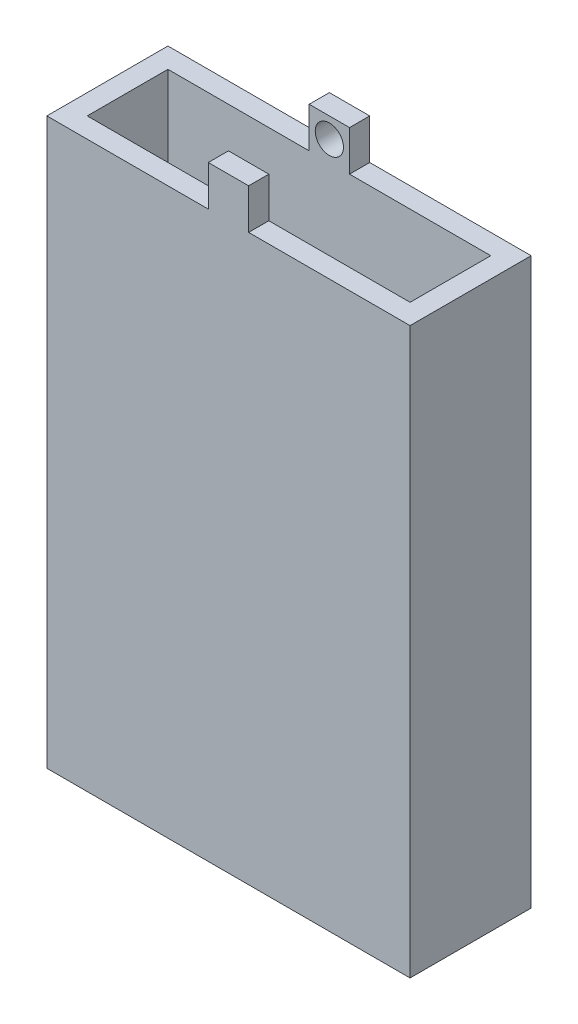
ISO-10303-21;
HEADER;
FILE_DESCRIPTION(('STEP AP214'),'2;1');
FILE_NAME('part.step','',(''),(''),'','','');
FILE_SCHEMA(('AUTOMOTIVE_DESIGN { 1 0 10303 214 1 1 1 1 }'));
ENDSEC;
DATA;
#1=APPLICATION_CONTEXT('core data for automotive mechanical design processes');
#2=APPLICATION_PROTOCOL_DEFINITION('international standard','automotive_design',2000,#1);
#3=PRODUCT_CONTEXT('',#1,'mechanical');
#4=PRODUCT('Part','Part','',(#3));
#5=PRODUCT_RELATED_PRODUCT_CATEGORY('part','',(#4));
#6=PRODUCT_DEFINITION_FORMATION('','',#4);
#7=PRODUCT_DEFINITION_CONTEXT('part definition',#1,'design');
#8=PRODUCT_DEFINITION('design','',#6,#7);
#9=PRODUCT_DEFINITION_SHAPE('','',#8);
#10=(LENGTH_UNIT() NAMED_UNIT(*) SI_UNIT(.MILLI.,.METRE.));
#11=(NAMED_UNIT(*) PLANE_ANGLE_UNIT() SI_UNIT($,.RADIAN.));
#12=(NAMED_UNIT(*) SI_UNIT($,.STERADIAN.) SOLID_ANGLE_UNIT());
#13=UNCERTAINTY_MEASURE_WITH_UNIT(LENGTH_MEASURE(1.E-05),#10,'distance_accuracy_value','');
#14=(GEOMETRIC_REPRESENTATION_CONTEXT(3) GLOBAL_UNCERTAINTY_ASSIGNED_CONTEXT((#13)) GLOBAL_UNIT_ASSIGNED_CONTEXT((#10,
#11,#12)) REPRESENTATION_CONTEXT('',''));
#15=CARTESIAN_POINT('',(0.,0.,0.));
#16=DIRECTION('',(0.,0.,1.));
#17=DIRECTION('',(1.,0.,0.));
#18=AXIS2_PLACEMENT_3D('',#15,#16,#17);
#19=CARTESIAN_POINT('',(-7.78802364302131,150.,-3.84234495329359));
#20=DIRECTION('',(1.,0.,0.));
#21=DIRECTION('',(0.,0.,-1.));
#22=AXIS2_PLACEMENT_3D('',#19,#20,#21);
#23=PLANE('',#22);
#24=DIRECTION('',(0.,0.,1.));
#25=VECTOR('',#24,1.);
#26=CARTESIAN_POINT('',(-7.78802364302131,150.,-3.84234495329359));
#27=LINE('',#26,#25);
#28=CARTESIAN_POINT('',(-7.78802364302132,150.,21.1576550467064));
#29=VERTEX_POINT('',#28);
#30=CARTESIAN_POINT('',(-7.78802364302131,150.,26.1576550467064));
#31=VERTEX_POINT('',#30);
#32=EDGE_CURVE('E165',#29,#31,#27,.T.);
#33=ORIENTED_EDGE('',*,*,#32,.F.);
#34=DIRECTION('',(0.,-1.,0.));
#35=VECTOR('',#34,1.);
#36=CARTESIAN_POINT('',(-7.78802364302132,150.,21.1576550467064));
#37=LINE('',#36,#35);
#38=CARTESIAN_POINT('',(-7.78802364302132,140.,21.1576550467064));
#39=VERTEX_POINT('',#38);
#40=EDGE_CURVE('E162',#29,#39,#37,.T.);
#41=ORIENTED_EDGE('',*,*,#40,.T.);
#42=DIRECTION('',(0.,0.,1.));
#43=VECTOR('',#42,1.);
#44=CARTESIAN_POINT('',(-7.78802364302131,140.,-3.84234495329359));
#45=LINE('',#44,#43);
#46=CARTESIAN_POINT('',(-7.78802364302129,140.,26.1576550467064));
#47=VERTEX_POINT('',#46);
#48=EDGE_CURVE('E11',#39,#47,#45,.T.);
#49=ORIENTED_EDGE('',*,*,#48,.T.);
#50=DIRECTION('',(0.,-1.,0.));
#51=VECTOR('',#50,1.);
#52=CARTESIAN_POINT('',(-7.78802364302131,150.,26.1576550467064));
#53=LINE('',#52,#51);
#54=EDGE_CURVE('E426',#31,#47,#53,.T.);
#55=ORIENTED_EDGE('',*,*,#54,.F.);
#56=EDGE_LOOP('',(#33,#41,#49,#55));
#57=FACE_BOUND('',#56,.T.);
#58=ADVANCED_FACE('F45',(#57),#23,.F.);
#59=CARTESIAN_POINT('',(2.21197635697867,150.,-3.84234495329359));
#60=DIRECTION('',(-1.,0.,0.));
#61=DIRECTION('',(0.,0.,1.));
#62=AXIS2_PLACEMENT_3D('',#59,#60,#61);
#63=PLANE('',#62);
#64=DIRECTION('',(0.,0.,-1.));
#65=VECTOR('',#64,1.);
#66=CARTESIAN_POINT('',(2.21197635697867,140.,-3.84234495329359));
#67=LINE('',#66,#65);
#68=CARTESIAN_POINT('',(2.21197635697869,140.,26.1576550467064));
#69=VERTEX_POINT('',#68);
#70=CARTESIAN_POINT('',(2.21197635697867,140.,21.1576550467064));
#71=VERTEX_POINT('',#70);
#72=EDGE_CURVE('E64',#69,#71,#67,.T.);
#73=ORIENTED_EDGE('',*,*,#72,.T.);
#74=DIRECTION('',(0.,-1.,0.));
#75=VECTOR('',#74,1.);
#76=CARTESIAN_POINT('',(2.21197635697867,150.,21.1576550467064));
#77=LINE('',#76,#75);
#78=CARTESIAN_POINT('',(2.21197635697867,150.,21.1576550467064));
#79=VERTEX_POINT('',#78);
#80=EDGE_CURVE('E300',#79,#71,#77,.T.);
#81=ORIENTED_EDGE('',*,*,#80,.F.);
#82=DIRECTION('',(0.,0.,-1.));
#83=VECTOR('',#82,1.);
#84=CARTESIAN_POINT('',(2.21197635697867,150.,-3.84234495329359));
#85=LINE('',#84,#83);
#86=CARTESIAN_POINT('',(2.21197635697867,150.,26.1576550467064));
#87=VERTEX_POINT('',#86);
#88=EDGE_CURVE('E285',#87,#79,#85,.T.);
#89=ORIENTED_EDGE('',*,*,#88,.F.);
#90=DIRECTION('',(0.,-1.,0.));
#91=VECTOR('',#90,1.);
#92=CARTESIAN_POINT('',(2.21197635697867,150.,26.1576550467064));
#93=LINE('',#92,#91);
#94=EDGE_CURVE('E428',#87,#69,#93,.T.);
#95=ORIENTED_EDGE('',*,*,#94,.T.);
#96=EDGE_LOOP('',(#73,#81,#89,#95));
#97=FACE_BOUND('',#96,.T.);
#98=ADVANCED_FACE('F338',(#97),#63,.F.);
#99=CARTESIAN_POINT('',(0.,150.,0.));
#100=DIRECTION('',(0.,1.,0.));
#101=DIRECTION('',(0.,0.,1.));
#102=AXIS2_PLACEMENT_3D('',#99,#100,#101);
#103=PLANE('',#102);
#104=DIRECTION('',(1.,0.,0.));
#105=VECTOR('',#104,1.);
#106=CARTESIAN_POINT('',(-7.78802364302132,150.,21.1576550467064));
#107=LINE('',#106,#105);
#108=EDGE_CURVE('E273',#29,#79,#107,.T.);
#109=ORIENTED_EDGE('',*,*,#108,.F.);
#110=ORIENTED_EDGE('',*,*,#32,.T.);
#111=DIRECTION('',(1.,0.,0.));
#112=VECTOR('',#111,1.);
#113=CARTESIAN_POINT('',(-7.78802364302131,150.,26.1576550467064));
#114=LINE('',#113,#112);
#115=EDGE_CURVE('E290',#31,#87,#114,.T.);
#116=ORIENTED_EDGE('',*,*,#115,.T.);
#117=ORIENTED_EDGE('',*,*,#88,.T.);
#118=EDGE_LOOP('',(#109,#110,#116,#117));
#119=FACE_BOUND('',#118,.T.);
#120=ADVANCED_FACE('F345',(#119),#103,.T.);
#121=CARTESIAN_POINT('',(0.,140.,0.));
#122=DIRECTION('',(0.,1.,0.));
#123=DIRECTION('',(0.,0.,1.));
#124=AXIS2_PLACEMENT_3D('',#121,#122,#123);
#125=PLANE('',#124);
#126=CARTESIAN_POINT('',(-7.78802364302129,140.,-3.84234495329359));
#127=VERTEX_POINT('',#126);
#128=CARTESIAN_POINT('',(-7.78802364302131,140.,1.15765504670641));
#129=VERTEX_POINT('',#128);
#130=EDGE_CURVE('E57',#127,#129,#45,.T.);
#131=ORIENTED_EDGE('',*,*,#130,.F.);
#132=DIRECTION('',(-1.,0.,0.));
#133=VECTOR('',#132,1.);
#134=CARTESIAN_POINT('',(42.2119763569787,140.,-3.84234495329359));
#135=LINE('',#134,#133);
#136=CARTESIAN_POINT('',(-47.7880236430213,140.,-3.84234495329358));
#137=VERTEX_POINT('',#136);
#138=EDGE_CURVE('E218',#127,#137,#135,.T.);
#139=ORIENTED_EDGE('',*,*,#138,.T.);
#140=DIRECTION('',(0.,0.,1.));
#141=VECTOR('',#140,1.);
#142=CARTESIAN_POINT('',(-47.7880236430213,140.,26.1576550467064));
#143=LINE('',#142,#141);
#144=CARTESIAN_POINT('',(-47.7880236430213,140.,26.1576550467064));
#145=VERTEX_POINT('',#144);
#146=EDGE_CURVE('E223',#137,#145,#143,.T.);
#147=ORIENTED_EDGE('',*,*,#146,.T.);
#148=DIRECTION('',(1.,0.,0.));
#149=VECTOR('',#148,1.);
#150=CARTESIAN_POINT('',(42.2119763569787,140.,26.1576550467064));
#151=LINE('',#150,#149);
#152=EDGE_CURVE('E72',#145,#47,#151,.T.);
#153=ORIENTED_EDGE('',*,*,#152,.T.);
#154=ORIENTED_EDGE('',*,*,#48,.F.);
#155=DIRECTION('',(1.,0.,0.));
#156=VECTOR('',#155,1.);
#157=CARTESIAN_POINT('',(-42.7880236430213,140.,21.1576550467064));
#158=LINE('',#157,#156);
#159=CARTESIAN_POINT('',(-42.7880236430213,140.,21.1576550467064));
#160=VERTEX_POINT('',#159);
#161=EDGE_CURVE('E176',#160,#39,#158,.T.);
#162=ORIENTED_EDGE('',*,*,#161,.F.);
#163=DIRECTION('',(0.,0.,1.));
#164=VECTOR('',#163,1.);
#165=CARTESIAN_POINT('',(-42.7880236430213,140.,1.15765504670641));
#166=LINE('',#165,#164);
#167=CARTESIAN_POINT('',(-42.7880236430213,140.,1.15765504670641));
#168=VERTEX_POINT('',#167);
#169=EDGE_CURVE('E190',#168,#160,#166,.T.);
#170=ORIENTED_EDGE('',*,*,#169,.F.);
#171=DIRECTION('',(-1.,0.,0.));
#172=VECTOR('',#171,1.);
#173=CARTESIAN_POINT('',(-42.7880236430213,140.,1.15765504670641));
#174=LINE('',#173,#172);
#175=EDGE_CURVE('E188',#129,#168,#174,.T.);
#176=ORIENTED_EDGE('',*,*,#175,.F.);
#177=EDGE_LOOP('',(#131,#139,#147,#153,#154,#162,#170,#176));
#178=FACE_BOUND('',#177,.T.);
#179=ADVANCED_FACE('F174',(#178),#125,.T.);
#180=CARTESIAN_POINT('',(42.2119763569787,140.,26.1576550467064));
#181=DIRECTION('',(-1.,0.,0.));
#182=DIRECTION('',(0.,0.,1.));
#183=AXIS2_PLACEMENT_3D('',#180,#181,#182);
#184=PLANE('',#183);
#185=DIRECTION('',(0.,0.,-1.));
#186=VECTOR('',#185,1.);
#187=CARTESIAN_POINT('',(42.2119763569787,0.,26.1576550467064));
#188=LINE('',#187,#186);
#189=CARTESIAN_POINT('',(42.2119763569787,0.,26.1576550467064));
#190=VERTEX_POINT('',#189);
#191=CARTESIAN_POINT('',(42.2119763569787,0.,-3.84234495329359));
#192=VERTEX_POINT('',#191);
#193=EDGE_CURVE('E203',#190,#192,#188,.T.);
#194=ORIENTED_EDGE('',*,*,#193,.T.);
#195=DIRECTION('',(0.,-1.,0.));
#196=VECTOR('',#195,1.);
#197=CARTESIAN_POINT('',(42.2119763569787,140.,-3.84234495329359));
#198=LINE('',#197,#196);
#199=CARTESIAN_POINT('',(42.2119763569787,140.,-3.84234495329359));
#200=VERTEX_POINT('',#199);
#201=EDGE_CURVE('E251',#200,#192,#198,.T.);
#202=ORIENTED_EDGE('',*,*,#201,.F.);
#203=DIRECTION('',(0.,0.,-1.));
#204=VECTOR('',#203,1.);
#205=CARTESIAN_POINT('',(42.2119763569787,140.,26.1576550467064));
#206=LINE('',#205,#204);
#207=CARTESIAN_POINT('',(42.2119763569787,140.,26.1576550467064));
#208=VERTEX_POINT('',#207);
#209=EDGE_CURVE('E214',#208,#200,#206,.T.);
#210=ORIENTED_EDGE('',*,*,#209,.F.);
#211=DIRECTION('',(0.,-1.,0.));
#212=VECTOR('',#211,1.);
#213=CARTESIAN_POINT('',(42.2119763569787,140.,26.1576550467064));
#214=LINE('',#213,#212);
#215=EDGE_CURVE('E229',#208,#190,#214,.T.);
#216=ORIENTED_EDGE('',*,*,#215,.T.);
#217=EDGE_LOOP('',(#194,#202,#210,#216));
#218=FACE_BOUND('',#217,.T.);
#219=ADVANCED_FACE('F47',(#218),#184,.F.);
#220=CARTESIAN_POINT('',(42.2119763569787,140.,-3.84234495329359));
#221=DIRECTION('',(0.,0.,1.));
#222=DIRECTION('',(1.,0.,0.));
#223=AXIS2_PLACEMENT_3D('',#220,#221,#222);
#224=PLANE('',#223);
#225=CARTESIAN_POINT('',(-2.78802364302131,145.,-3.84234495329359));
#226=DIRECTION('',(0.,0.,-1.));
#227=DIRECTION('',(-1.,0.,0.));
#228=AXIS2_PLACEMENT_3D('',#225,#226,#227);
#229=CIRCLE('',#228,3.5);
#230=CARTESIAN_POINT('',(-6.28802364302132,145.,-3.84234495329359));
#231=VERTEX_POINT('',#230);
#232=EDGE_CURVE('E309',#231,#231,#229,.T.);
#233=ORIENTED_EDGE('',*,*,#232,.F.);
#234=EDGE_LOOP('',(#233));
#235=FACE_BOUND('',#234,.T.);
#236=DIRECTION('',(-1.,0.,0.));
#237=VECTOR('',#236,1.);
#238=CARTESIAN_POINT('',(42.2119763569787,0.,-3.84234495329359));
#239=LINE('',#238,#237);
#240=CARTESIAN_POINT('',(-47.7880236430213,0.,-3.84234495329358));
#241=VERTEX_POINT('',#240);
#242=EDGE_CURVE('E233',#192,#241,#239,.T.);
#243=ORIENTED_EDGE('',*,*,#242,.T.);
#244=DIRECTION('',(0.,-1.,0.));
#245=VECTOR('',#244,1.);
#246=CARTESIAN_POINT('',(-47.7880236430213,140.,-3.84234495329358));
#247=LINE('',#246,#245);
#248=EDGE_CURVE('E248',#137,#241,#247,.T.);
#249=ORIENTED_EDGE('',*,*,#248,.F.);
#250=ORIENTED_EDGE('',*,*,#138,.F.);
#251=DIRECTION('',(0.,-1.,0.));
#252=VECTOR('',#251,1.);
#253=CARTESIAN_POINT('',(-7.78802364302131,150.,-3.84234495329359));
#254=LINE('',#253,#252);
#255=CARTESIAN_POINT('',(-7.78802364302131,150.,-3.84234495329359));
#256=VERTEX_POINT('',#255);
#257=EDGE_CURVE('E284',#256,#127,#254,.T.);
#258=ORIENTED_EDGE('',*,*,#257,.F.);
#259=DIRECTION('',(-1.,0.,0.));
#260=VECTOR('',#259,1.);
#261=CARTESIAN_POINT('',(-7.78802364302131,150.,-3.84234495329359));
#262=LINE('',#261,#260);
#263=CARTESIAN_POINT('',(2.21197635697867,150.,-3.84234495329359));
#264=VERTEX_POINT('',#263);
#265=EDGE_CURVE('E281',#264,#256,#262,.T.);
#266=ORIENTED_EDGE('',*,*,#265,.F.);
#267=DIRECTION('',(0.,-1.,0.));
#268=VECTOR('',#267,1.);
#269=CARTESIAN_POINT('',(2.21197635697867,150.,-3.84234495329359));
#270=LINE('',#269,#268);
#271=CARTESIAN_POINT('',(2.21197635697867,140.,-3.84234495329359));
#272=VERTEX_POINT('',#271);
#273=EDGE_CURVE('E432',#264,#272,#270,.T.);
#274=ORIENTED_EDGE('',*,*,#273,.T.);
#275=EDGE_CURVE('E220',#200,#272,#135,.T.);
#276=ORIENTED_EDGE('',*,*,#275,.F.);
#277=ORIENTED_EDGE('',*,*,#201,.T.);
#278=EDGE_LOOP('',(#243,#249,#250,#258,#266,#274,#276,#277));
#279=FACE_BOUND('',#278,.T.);
#280=ADVANCED_FACE('F386',(#235,#279),#224,.F.);
#281=CARTESIAN_POINT('',(-47.7880236430213,140.,26.1576550467064));
#282=DIRECTION('',(1.,0.,0.));
#283=DIRECTION('',(0.,0.,-1.));
#284=AXIS2_PLACEMENT_3D('',#281,#282,#283);
#285=PLANE('',#284);
#286=DIRECTION('',(0.,0.,1.));
#287=VECTOR('',#286,1.);
#288=CARTESIAN_POINT('',(-47.7880236430213,0.,26.1576550467064));
#289=LINE('',#288,#287);
#290=CARTESIAN_POINT('',(-47.7880236430213,0.,26.1576550467064));
#291=VERTEX_POINT('',#290);
#292=EDGE_CURVE('E236',#241,#291,#289,.T.);
#293=ORIENTED_EDGE('',*,*,#292,.T.);
#294=DIRECTION('',(0.,-1.,0.));
#295=VECTOR('',#294,1.);
#296=CARTESIAN_POINT('',(-47.7880236430213,140.,26.1576550467064));
#297=LINE('',#296,#295);
#298=EDGE_CURVE('E244',#145,#291,#297,.T.);
#299=ORIENTED_EDGE('',*,*,#298,.F.);
#300=ORIENTED_EDGE('',*,*,#146,.F.);
#301=ORIENTED_EDGE('',*,*,#248,.T.);
#302=EDGE_LOOP('',(#293,#299,#300,#301));
#303=FACE_BOUND('',#302,.T.);
#304=ADVANCED_FACE('F383',(#303),#285,.F.);
#305=CARTESIAN_POINT('',(42.2119763569787,140.,26.1576550467064));
#306=DIRECTION('',(0.,0.,-1.));
#307=DIRECTION('',(-1.,0.,0.));
#308=AXIS2_PLACEMENT_3D('',#305,#306,#307);
#309=PLANE('',#308);
#310=DIRECTION('',(1.,0.,0.));
#311=VECTOR('',#310,1.);
#312=CARTESIAN_POINT('',(42.2119763569787,0.,26.1576550467064));
#313=LINE('',#312,#311);
#314=EDGE_CURVE('E219',#291,#190,#313,.T.);
#315=ORIENTED_EDGE('',*,*,#314,.T.);
#316=ORIENTED_EDGE('',*,*,#215,.F.);
#317=EDGE_CURVE('E226',#69,#208,#151,.T.);
#318=ORIENTED_EDGE('',*,*,#317,.F.);
#319=ORIENTED_EDGE('',*,*,#94,.F.);
#320=ORIENTED_EDGE('',*,*,#115,.F.);
#321=ORIENTED_EDGE('',*,*,#54,.T.);
#322=ORIENTED_EDGE('',*,*,#152,.F.);
#323=ORIENTED_EDGE('',*,*,#298,.T.);
#324=EDGE_LOOP('',(#315,#316,#318,#319,#320,#321,#322,#323));
#325=FACE_BOUND('',#324,.T.);
#326=ADVANCED_FACE('F378',(#325),#309,.F.);
#327=ORIENTED_EDGE('',*,*,#72,.F.);
#328=ORIENTED_EDGE('',*,*,#317,.T.);
#329=ORIENTED_EDGE('',*,*,#209,.T.);
#330=ORIENTED_EDGE('',*,*,#275,.T.);
#331=CARTESIAN_POINT('',(2.21197635697867,140.,1.15765504670641));
#332=VERTEX_POINT('',#331);
#333=EDGE_CURVE('E55',#332,#272,#67,.T.);
#334=ORIENTED_EDGE('',*,*,#333,.F.);
#335=CARTESIAN_POINT('',(37.2119763569787,140.,1.15765504670641));
#336=VERTEX_POINT('',#335);
#337=EDGE_CURVE('E194',#336,#332,#174,.T.);
#338=ORIENTED_EDGE('',*,*,#337,.F.);
#339=DIRECTION('',(0.,0.,-1.));
#340=VECTOR('',#339,1.);
#341=CARTESIAN_POINT('',(37.2119763569787,140.,1.15765504670641));
#342=LINE('',#341,#340);
#343=CARTESIAN_POINT('',(37.2119763569787,140.,21.1576550467064));
#344=VERTEX_POINT('',#343);
#345=EDGE_CURVE('E182',#344,#336,#342,.T.);
#346=ORIENTED_EDGE('',*,*,#345,.F.);
#347=EDGE_CURVE('E183',#71,#344,#158,.T.);
#348=ORIENTED_EDGE('',*,*,#347,.F.);
#349=EDGE_LOOP('',(#327,#328,#329,#330,#334,#338,#346,#348));
#350=FACE_BOUND('',#349,.T.);
#351=ADVANCED_FACE('F376',(#350),#125,.T.);
#352=CARTESIAN_POINT('',(0.,0.,0.));
#353=DIRECTION('',(0.,1.,0.));
#354=DIRECTION('',(0.,0.,1.));
#355=AXIS2_PLACEMENT_3D('',#352,#353,#354);
#356=PLANE('',#355);
#357=ORIENTED_EDGE('',*,*,#193,.F.);
#358=ORIENTED_EDGE('',*,*,#314,.F.);
#359=ORIENTED_EDGE('',*,*,#292,.F.);
#360=ORIENTED_EDGE('',*,*,#242,.F.);
#361=EDGE_LOOP('',(#357,#358,#359,#360));
#362=FACE_BOUND('',#361,.T.);
#363=ADVANCED_FACE('F374',(#362),#356,.F.);
#364=CARTESIAN_POINT('',(-42.7880236430213,5.,1.15765504670641));
#365=DIRECTION('',(-1.,0.,0.));
#366=DIRECTION('',(0.,0.,1.));
#367=AXIS2_PLACEMENT_3D('',#364,#365,#366);
#368=PLANE('',#367);
#369=ORIENTED_EDGE('',*,*,#169,.T.);
#370=DIRECTION('',(0.,1.,0.));
#371=VECTOR('',#370,1.);
#372=CARTESIAN_POINT('',(-42.7880236430213,5.,21.1576550467064));
#373=LINE('',#372,#371);
#374=CARTESIAN_POINT('',(-42.7880236430213,5.,21.1576550467064));
#375=VERTEX_POINT('',#374);
#376=EDGE_CURVE('E180',#375,#160,#373,.T.);
#377=ORIENTED_EDGE('',*,*,#376,.F.);
#378=DIRECTION('',(0.,0.,1.));
#379=VECTOR('',#378,1.);
#380=CARTESIAN_POINT('',(-42.7880236430213,5.,1.15765504670641));
#381=LINE('',#380,#379);
#382=CARTESIAN_POINT('',(-42.7880236430213,5.,1.15765504670641));
#383=VERTEX_POINT('',#382);
#384=EDGE_CURVE('E198',#383,#375,#381,.T.);
#385=ORIENTED_EDGE('',*,*,#384,.F.);
#386=DIRECTION('',(0.,1.,0.));
#387=VECTOR('',#386,1.);
#388=CARTESIAN_POINT('',(-42.7880236430213,5.,1.15765504670641));
#389=LINE('',#388,#387);
#390=EDGE_CURVE('E199',#383,#168,#389,.T.);
#391=ORIENTED_EDGE('',*,*,#390,.T.);
#392=EDGE_LOOP('',(#369,#377,#385,#391));
#393=FACE_BOUND('',#392,.T.);
#394=ADVANCED_FACE('F368',(#393),#368,.F.);
#395=CARTESIAN_POINT('',(-42.7880236430213,5.,1.15765504670641));
#396=DIRECTION('',(0.,0.,-1.));
#397=DIRECTION('',(-1.,0.,0.));
#398=AXIS2_PLACEMENT_3D('',#395,#396,#397);
#399=PLANE('',#398);
#400=CARTESIAN_POINT('',(-2.78802364302131,145.,1.15765504670641));
#401=DIRECTION('',(0.,0.,-1.));
#402=DIRECTION('',(-1.,0.,0.));
#403=AXIS2_PLACEMENT_3D('',#400,#401,#402);
#404=CIRCLE('',#403,3.5);
#405=CARTESIAN_POINT('',(-6.28802364302132,145.,1.15765504670641));
#406=VERTEX_POINT('',#405);
#407=EDGE_CURVE('E303',#406,#406,#404,.T.);
#408=ORIENTED_EDGE('',*,*,#407,.T.);
#409=EDGE_LOOP('',(#408));
#410=FACE_BOUND('',#409,.T.);
#411=ORIENTED_EDGE('',*,*,#337,.T.);
#412=DIRECTION('',(0.,1.,0.));
#413=VECTOR('',#412,1.);
#414=CARTESIAN_POINT('',(2.21197635697867,150.,1.15765504670641));
#415=LINE('',#414,#413);
#416=CARTESIAN_POINT('',(2.21197635697867,150.,1.15765504670641));
#417=VERTEX_POINT('',#416);
#418=EDGE_CURVE('E171',#332,#417,#415,.T.);
#419=ORIENTED_EDGE('',*,*,#418,.T.);
#420=DIRECTION('',(1.,0.,0.));
#421=VECTOR('',#420,1.);
#422=CARTESIAN_POINT('',(-7.78802364302132,150.,1.15765504670641));
#423=LINE('',#422,#421);
#424=CARTESIAN_POINT('',(-7.78802364302132,150.,1.15765504670641));
#425=VERTEX_POINT('',#424);
#426=EDGE_CURVE('E278',#425,#417,#423,.T.);
#427=ORIENTED_EDGE('',*,*,#426,.F.);
#428=DIRECTION('',(0.,1.,0.));
#429=VECTOR('',#428,1.);
#430=CARTESIAN_POINT('',(-7.78802364302132,150.,1.15765504670641));
#431=LINE('',#430,#429);
#432=EDGE_CURVE('E170',#129,#425,#431,.T.);
#433=ORIENTED_EDGE('',*,*,#432,.F.);
#434=ORIENTED_EDGE('',*,*,#175,.T.);
#435=ORIENTED_EDGE('',*,*,#390,.F.);
#436=DIRECTION('',(-1.,0.,0.));
#437=VECTOR('',#436,1.);
#438=CARTESIAN_POINT('',(-42.7880236430213,5.,1.15765504670641));
#439=LINE('',#438,#437);
#440=CARTESIAN_POINT('',(37.2119763569787,5.,1.15765504670641));
#441=VERTEX_POINT('',#440);
#442=EDGE_CURVE('E213',#441,#383,#439,.T.);
#443=ORIENTED_EDGE('',*,*,#442,.F.);
#444=DIRECTION('',(0.,1.,0.));
#445=VECTOR('',#444,1.);
#446=CARTESIAN_POINT('',(37.2119763569787,5.,1.15765504670641));
#447=LINE('',#446,#445);
#448=EDGE_CURVE('E204',#441,#336,#447,.T.);
#449=ORIENTED_EDGE('',*,*,#448,.T.);
#450=EDGE_LOOP('',(#411,#419,#427,#433,#434,#435,#443,#449));
#451=FACE_BOUND('',#450,.T.);
#452=ADVANCED_FACE('F365',(#410,#451),#399,.F.);
#453=CARTESIAN_POINT('',(37.2119763569787,5.,1.15765504670641));
#454=DIRECTION('',(1.,0.,0.));
#455=DIRECTION('',(0.,0.,-1.));
#456=AXIS2_PLACEMENT_3D('',#453,#454,#455);
#457=PLANE('',#456);
#458=ORIENTED_EDGE('',*,*,#345,.T.);
#459=ORIENTED_EDGE('',*,*,#448,.F.);
#460=DIRECTION('',(0.,0.,-1.));
#461=VECTOR('',#460,1.);
#462=CARTESIAN_POINT('',(37.2119763569787,5.,1.15765504670641));
#463=LINE('',#462,#461);
#464=CARTESIAN_POINT('',(37.2119763569787,5.,21.1576550467064));
#465=VERTEX_POINT('',#464);
#466=EDGE_CURVE('E411',#465,#441,#463,.T.);
#467=ORIENTED_EDGE('',*,*,#466,.F.);
#468=DIRECTION('',(0.,1.,0.));
#469=VECTOR('',#468,1.);
#470=CARTESIAN_POINT('',(37.2119763569787,5.,21.1576550467064));
#471=LINE('',#470,#469);
#472=EDGE_CURVE('E207',#465,#344,#471,.T.);
#473=ORIENTED_EDGE('',*,*,#472,.T.);
#474=EDGE_LOOP('',(#458,#459,#467,#473));
#475=FACE_BOUND('',#474,.T.);
#476=ADVANCED_FACE('F361',(#475),#457,.F.);
#477=CARTESIAN_POINT('',(-42.7880236430213,5.,21.1576550467064));
#478=DIRECTION('',(0.,0.,1.));
#479=DIRECTION('',(1.,0.,0.));
#480=AXIS2_PLACEMENT_3D('',#477,#478,#479);
#481=PLANE('',#480);
#482=CARTESIAN_POINT('',(-2.78802364302131,145.,21.1576550467064));
#483=DIRECTION('',(0.,0.,1.));
#484=DIRECTION('',(1.,0.,0.));
#485=AXIS2_PLACEMENT_3D('',#482,#483,#484);
#486=CIRCLE('',#485,3.5);
#487=CARTESIAN_POINT('',(0.711976356978691,145.,21.1576550467064));
#488=VERTEX_POINT('',#487);
#489=EDGE_CURVE('E49',#488,#488,#486,.T.);
#490=ORIENTED_EDGE('',*,*,#489,.T.);
#491=EDGE_LOOP('',(#490));
#492=FACE_BOUND('',#491,.T.);
#493=ORIENTED_EDGE('',*,*,#161,.T.);
#494=ORIENTED_EDGE('',*,*,#40,.F.);
#495=ORIENTED_EDGE('',*,*,#108,.T.);
#496=ORIENTED_EDGE('',*,*,#80,.T.);
#497=ORIENTED_EDGE('',*,*,#347,.T.);
#498=ORIENTED_EDGE('',*,*,#472,.F.);
#499=DIRECTION('',(1.,0.,0.));
#500=VECTOR('',#499,1.);
#501=CARTESIAN_POINT('',(-42.7880236430213,5.,21.1576550467064));
#502=LINE('',#501,#500);
#503=EDGE_CURVE('E414',#375,#465,#502,.T.);
#504=ORIENTED_EDGE('',*,*,#503,.F.);
#505=ORIENTED_EDGE('',*,*,#376,.T.);
#506=EDGE_LOOP('',(#493,#494,#495,#496,#497,#498,#504,#505));
#507=FACE_BOUND('',#506,.T.);
#508=ADVANCED_FACE('F178',(#492,#507),#481,.F.);
#509=CARTESIAN_POINT('',(0.,5.,0.));
#510=DIRECTION('',(0.,1.,0.));
#511=DIRECTION('',(0.,0.,1.));
#512=AXIS2_PLACEMENT_3D('',#509,#510,#511);
#513=PLANE('',#512);
#514=ORIENTED_EDGE('',*,*,#384,.T.);
#515=ORIENTED_EDGE('',*,*,#503,.T.);
#516=ORIENTED_EDGE('',*,*,#466,.T.);
#517=ORIENTED_EDGE('',*,*,#442,.T.);
#518=EDGE_LOOP('',(#514,#515,#516,#517));
#519=FACE_BOUND('',#518,.T.);
#520=ADVANCED_FACE('F350',(#519),#513,.T.);
#521=ORIENTED_EDGE('',*,*,#130,.T.);
#522=ORIENTED_EDGE('',*,*,#432,.T.);
#523=EDGE_CURVE('E270',#256,#425,#27,.T.);
#524=ORIENTED_EDGE('',*,*,#523,.F.);
#525=ORIENTED_EDGE('',*,*,#257,.T.);
#526=EDGE_LOOP('',(#521,#522,#524,#525));
#527=FACE_BOUND('',#526,.T.);
#528=ADVANCED_FACE('F340',(#527),#23,.F.);
#529=EDGE_CURVE('E289',#417,#264,#85,.T.);
#530=ORIENTED_EDGE('',*,*,#529,.F.);
#531=ORIENTED_EDGE('',*,*,#418,.F.);
#532=ORIENTED_EDGE('',*,*,#333,.T.);
#533=ORIENTED_EDGE('',*,*,#273,.F.);
#534=EDGE_LOOP('',(#530,#531,#532,#533));
#535=FACE_BOUND('',#534,.T.);
#536=ADVANCED_FACE('F347',(#535),#63,.F.);
#537=ORIENTED_EDGE('',*,*,#426,.T.);
#538=ORIENTED_EDGE('',*,*,#529,.T.);
#539=ORIENTED_EDGE('',*,*,#265,.T.);
#540=ORIENTED_EDGE('',*,*,#523,.T.);
#541=EDGE_LOOP('',(#537,#538,#539,#540));
#542=FACE_BOUND('',#541,.T.);
#543=ADVANCED_FACE('F334',(#542),#103,.T.);
#544=CARTESIAN_POINT('',(-2.78802364302131,145.,23.6576550467064));
#545=DIRECTION('',(0.,0.,-1.));
#546=DIRECTION('',(-1.,0.,0.));
#547=AXIS2_PLACEMENT_3D('',#544,#545,#546);
#548=PLANE('',#547);
#549=CARTESIAN_POINT('',(-2.78802364302131,145.,23.6576550467064));
#550=DIRECTION('',(0.,0.,-1.));
#551=DIRECTION('',(-1.,0.,0.));
#552=AXIS2_PLACEMENT_3D('',#549,#550,#551);
#553=CIRCLE('',#552,3.5);
#554=CARTESIAN_POINT('',(-6.28802364302131,145.,23.6576550467064));
#555=VERTEX_POINT('',#554);
#556=EDGE_CURVE('E313',#555,#555,#553,.T.);
#557=ORIENTED_EDGE('',*,*,#556,.T.);
#558=EDGE_LOOP('',(#557));
#559=FACE_BOUND('',#558,.T.);
#560=ADVANCED_FACE('F326',(#559),#548,.T.);
#561=CARTESIAN_POINT('',(-2.78802364302131,145.,23.6576550467064));
#562=DIRECTION('',(0.,0.,-1.));
#563=DIRECTION('',(-1.,0.,0.));
#564=AXIS2_PLACEMENT_3D('',#561,#562,#563);
#565=CYLINDRICAL_SURFACE('',#564,3.5);
#566=ORIENTED_EDGE('',*,*,#556,.F.);
#567=EDGE_LOOP('',(#566));
#568=FACE_BOUND('',#567,.T.);
#569=ORIENTED_EDGE('',*,*,#489,.F.);
#570=EDGE_LOOP('',(#569));
#571=FACE_BOUND('',#570,.T.);
#572=ADVANCED_FACE('F323',(#568,#571),#565,.F.);
#573=ORIENTED_EDGE('',*,*,#232,.T.);
#574=EDGE_LOOP('',(#573));
#575=FACE_BOUND('',#574,.T.);
#576=ORIENTED_EDGE('',*,*,#407,.F.);
#577=EDGE_LOOP('',(#576));
#578=FACE_BOUND('',#577,.T.);
#579=ADVANCED_FACE('F325',(#575,#578),#565,.F.);
#580=CLOSED_SHELL('',(#58,#98,#120,#179,#219,#280,#304,#326,#351,#363,#394,#452,#476,#508,#520,
#528,#536,#543,#560,#572,#579));
#581=MANIFOLD_SOLID_BREP('B2',#580);
#582=ADVANCED_BREP_SHAPE_REPRESENTATION('',(#18,#581),#14);
#583=SHAPE_DEFINITION_REPRESENTATION(#9,#582);
ENDSEC;
END-ISO-10303-21;
